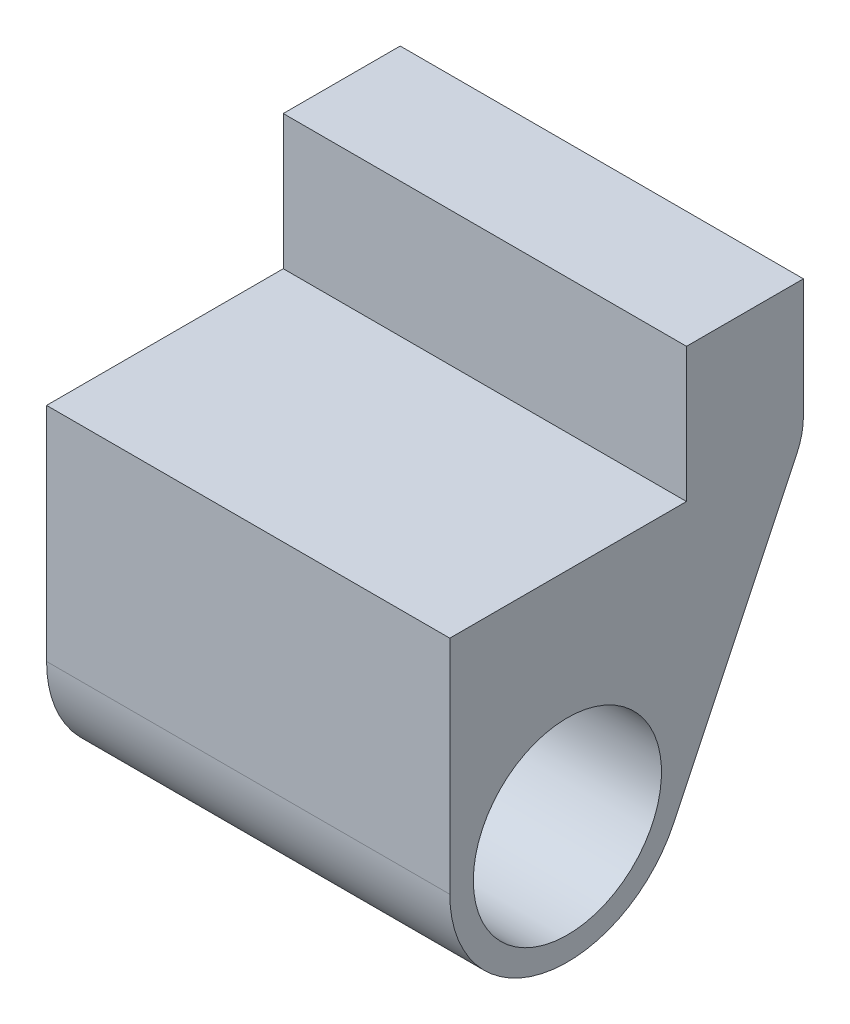
ISO-10303-21;
HEADER;
FILE_DESCRIPTION(('STEP AP214'),'2;1');
FILE_NAME('part.step','',(''),(''),'','','');
FILE_SCHEMA(('AUTOMOTIVE_DESIGN { 1 0 10303 214 1 1 1 1 }'));
ENDSEC;
DATA;
#1=APPLICATION_CONTEXT('core data for automotive mechanical design processes');
#2=APPLICATION_PROTOCOL_DEFINITION('international standard','automotive_design',2000,#1);
#3=PRODUCT_CONTEXT('',#1,'mechanical');
#4=PRODUCT('Part','Part','',(#3));
#5=PRODUCT_RELATED_PRODUCT_CATEGORY('part','',(#4));
#6=PRODUCT_DEFINITION_FORMATION('','',#4);
#7=PRODUCT_DEFINITION_CONTEXT('part definition',#1,'design');
#8=PRODUCT_DEFINITION('design','',#6,#7);
#9=PRODUCT_DEFINITION_SHAPE('','',#8);
#10=(LENGTH_UNIT() NAMED_UNIT(*) SI_UNIT(.MILLI.,.METRE.));
#11=(NAMED_UNIT(*) PLANE_ANGLE_UNIT() SI_UNIT($,.RADIAN.));
#12=(NAMED_UNIT(*) SI_UNIT($,.STERADIAN.) SOLID_ANGLE_UNIT());
#13=UNCERTAINTY_MEASURE_WITH_UNIT(LENGTH_MEASURE(1.E-05),#10,'distance_accuracy_value','');
#14=(GEOMETRIC_REPRESENTATION_CONTEXT(3) GLOBAL_UNCERTAINTY_ASSIGNED_CONTEXT((#13)) GLOBAL_UNIT_ASSIGNED_CONTEXT((#10,
#11,#12)) REPRESENTATION_CONTEXT('',''));
#15=CARTESIAN_POINT('',(0.,0.,0.));
#16=DIRECTION('',(0.,0.,1.));
#17=DIRECTION('',(1.,0.,0.));
#18=AXIS2_PLACEMENT_3D('',#15,#16,#17);
#19=CARTESIAN_POINT('',(0.,0.,0.));
#20=DIRECTION('',(-1.,0.,0.));
#21=DIRECTION('',(0.,0.,1.));
#22=AXIS2_PLACEMENT_3D('',#19,#20,#21);
#23=PLANE('',#22);
#24=CARTESIAN_POINT('',(0.,7.,0.));
#25=DIRECTION('',(-1.,0.,0.));
#26=DIRECTION('',(0.,0.,-1.));
#27=AXIS2_PLACEMENT_3D('',#24,#25,#26);
#28=CIRCLE('',#27,9.525);
#29=CARTESIAN_POINT('',(0.,7.,-9.52499999999997));
#30=VERTEX_POINT('',#29);
#31=EDGE_CURVE('E190',#30,#30,#28,.T.);
#32=ORIENTED_EDGE('',*,*,#31,.F.);
#33=EDGE_LOOP('',(#32));
#34=FACE_BOUND('',#33,.T.);
#35=CARTESIAN_POINT('',(0.,44.7824585817962,-31.9018486983709));
#36=DIRECTION('',(-1.,0.,0.));
#37=DIRECTION('',(0.,-0.22060552327773,-0.975363113460499));
#38=AXIS2_PLACEMENT_3D('',#35,#36,#37);
#39=CIRCLE('',#38,12.7);
#40=CARTESIAN_POINT('',(0.,44.7824585817962,-44.6018486983709));
#41=VERTEX_POINT('',#40);
#42=CARTESIAN_POINT('',(0.,39.3171281350152,-43.3657120570946));
#43=VERTEX_POINT('',#42);
#44=EDGE_CURVE('E212',#41,#43,#39,.T.);
#45=ORIENTED_EDGE('',*,*,#44,.T.);
#46=DIRECTION('',(0.,0.902666406198719,-0.430340980061497));
#47=VECTOR('',#46,1.);
#48=CARTESIAN_POINT('',(0.,41.91,-44.6018486983709));
#49=LINE('',#48,#47);
#50=CARTESIAN_POINT('',(0.,-9.56432828186677,-20.0617608777666));
#51=VERTEX_POINT('',#50);
#52=EDGE_CURVE('E160',#51,#43,#49,.T.);
#53=ORIENTED_EDGE('',*,*,#52,.F.);
#54=CARTESIAN_POINT('',(0.,0.,0.));
#55=DIRECTION('',(-1.,0.,0.));
#56=DIRECTION('',(0.,1.,0.));
#57=AXIS2_PLACEMENT_3D('',#54,#55,#56);
#58=CIRCLE('',#57,22.225);
#59=CARTESIAN_POINT('',(0.,0.,22.225));
#60=VERTEX_POINT('',#59);
#61=EDGE_CURVE('E11',#51,#60,#58,.T.);
#62=ORIENTED_EDGE('',*,*,#61,.T.);
#63=DIRECTION('',(0.,1.,0.));
#64=VECTOR('',#63,1.);
#65=CARTESIAN_POINT('',(0.,0.,22.225));
#66=LINE('',#65,#64);
#67=CARTESIAN_POINT('',(0.,41.91,22.225));
#68=VERTEX_POINT('',#67);
#69=EDGE_CURVE('E46',#60,#68,#66,.T.);
#70=ORIENTED_EDGE('',*,*,#69,.T.);
#71=DIRECTION('',(0.,0.,-1.));
#72=VECTOR('',#71,1.);
#73=CARTESIAN_POINT('',(0.,41.91,22.225));
#74=LINE('',#73,#72);
#75=CARTESIAN_POINT('',(0.,41.91,-22.5038486983708));
#76=VERTEX_POINT('',#75);
#77=EDGE_CURVE('E72',#68,#76,#74,.T.);
#78=ORIENTED_EDGE('',*,*,#77,.T.);
#79=DIRECTION('',(0.,-1.,0.));
#80=VECTOR('',#79,1.);
#81=CARTESIAN_POINT('',(0.,41.91,-22.5038486983708));
#82=LINE('',#81,#80);
#83=CARTESIAN_POINT('',(0.,67.31,-22.5038486983708));
#84=VERTEX_POINT('',#83);
#85=EDGE_CURVE('E163',#84,#76,#82,.T.);
#86=ORIENTED_EDGE('',*,*,#85,.F.);
#87=DIRECTION('',(0.,0.,1.));
#88=VECTOR('',#87,1.);
#89=CARTESIAN_POINT('',(0.,67.31,-22.5038486983708));
#90=LINE('',#89,#88);
#91=CARTESIAN_POINT('',(0.,67.31,-44.6018486983709));
#92=VERTEX_POINT('',#91);
#93=EDGE_CURVE('E64',#92,#84,#90,.T.);
#94=ORIENTED_EDGE('',*,*,#93,.F.);
#95=DIRECTION('',(0.,1.,0.));
#96=VECTOR('',#95,1.);
#97=CARTESIAN_POINT('',(0.,67.31,-44.6018486983709));
#98=LINE('',#97,#96);
#99=EDGE_CURVE('E183',#41,#92,#98,.T.);
#100=ORIENTED_EDGE('',*,*,#99,.F.);
#101=EDGE_LOOP('',(#45,#53,#62,#70,#78,#86,#94,#100));
#102=FACE_BOUND('',#101,.T.);
#103=ADVANCED_FACE('F17',(#34,#102),#23,.T.);
#104=CARTESIAN_POINT('',(0.,0.,0.));
#105=DIRECTION('',(-1.,0.,0.));
#106=DIRECTION('',(0.,-0.9753631134605,0.220605523277729));
#107=AXIS2_PLACEMENT_3D('',#104,#105,#106);
#108=CYLINDRICAL_SURFACE('',#107,22.225);
#109=DIRECTION('',(-1.,0.,0.));
#110=VECTOR('',#109,1.);
#111=CARTESIAN_POINT('',(0.,-9.5643282818668,-20.0617608777665));
#112=LINE('',#111,#110);
#113=CARTESIAN_POINT('',(76.2,-9.56432828186677,-20.0617608777666));
#114=VERTEX_POINT('',#113);
#115=EDGE_CURVE('E124',#114,#51,#112,.T.);
#116=ORIENTED_EDGE('',*,*,#115,.F.);
#117=CARTESIAN_POINT('',(76.2,0.,0.));
#118=DIRECTION('',(-1.,0.,0.));
#119=DIRECTION('',(0.,1.,0.));
#120=AXIS2_PLACEMENT_3D('',#117,#118,#119);
#121=CIRCLE('',#120,22.225);
#122=CARTESIAN_POINT('',(76.2,0.,22.225));
#123=VERTEX_POINT('',#122);
#124=EDGE_CURVE('E122',#114,#123,#121,.T.);
#125=ORIENTED_EDGE('',*,*,#124,.T.);
#126=DIRECTION('',(1.,0.,0.));
#127=VECTOR('',#126,1.);
#128=CARTESIAN_POINT('',(0.,0.,22.225));
#129=LINE('',#128,#127);
#130=EDGE_CURVE('E26',#60,#123,#129,.T.);
#131=ORIENTED_EDGE('',*,*,#130,.F.);
#132=ORIENTED_EDGE('',*,*,#61,.F.);
#133=EDGE_LOOP('',(#116,#125,#131,#132));
#134=FACE_BOUND('',#133,.T.);
#135=ADVANCED_FACE('F19',(#134),#108,.T.);
#136=CARTESIAN_POINT('',(0.,0.,22.225));
#137=DIRECTION('',(0.,0.,-1.));
#138=DIRECTION('',(0.,-1.,0.));
#139=AXIS2_PLACEMENT_3D('',#136,#137,#138);
#140=PLANE('',#139);
#141=ORIENTED_EDGE('',*,*,#69,.F.);
#142=ORIENTED_EDGE('',*,*,#130,.T.);
#143=DIRECTION('',(0.,1.,0.));
#144=VECTOR('',#143,1.);
#145=CARTESIAN_POINT('',(76.2,0.,22.225));
#146=LINE('',#145,#144);
#147=CARTESIAN_POINT('',(76.2,41.91,22.225));
#148=VERTEX_POINT('',#147);
#149=EDGE_CURVE('E116',#123,#148,#146,.T.);
#150=ORIENTED_EDGE('',*,*,#149,.T.);
#151=DIRECTION('',(1.,0.,0.));
#152=VECTOR('',#151,1.);
#153=CARTESIAN_POINT('',(0.,41.91,22.225));
#154=LINE('',#153,#152);
#155=EDGE_CURVE('E108',#68,#148,#154,.T.);
#156=ORIENTED_EDGE('',*,*,#155,.F.);
#157=EDGE_LOOP('',(#141,#142,#150,#156));
#158=FACE_BOUND('',#157,.T.);
#159=ADVANCED_FACE('F114',(#158),#140,.F.);
#160=CARTESIAN_POINT('',(5.08,0.,0.));
#161=DIRECTION('',(-1.,0.,0.));
#162=DIRECTION('',(0.,0.,1.));
#163=AXIS2_PLACEMENT_3D('',#160,#161,#162);
#164=PLANE('',#163);
#165=CARTESIAN_POINT('',(5.08,7.,0.));
#166=DIRECTION('',(1.,0.,0.));
#167=DIRECTION('',(0.,0.,-1.));
#168=AXIS2_PLACEMENT_3D('',#165,#166,#167);
#169=CIRCLE('',#168,9.525);
#170=CARTESIAN_POINT('',(5.08,7.,-9.52499999999997));
#171=VERTEX_POINT('',#170);
#172=EDGE_CURVE('E193',#171,#171,#169,.T.);
#173=ORIENTED_EDGE('',*,*,#172,.F.);
#174=EDGE_LOOP('',(#173));
#175=FACE_BOUND('',#174,.T.);
#176=CARTESIAN_POINT('',(5.08,0.,0.));
#177=DIRECTION('',(1.,0.,0.));
#178=DIRECTION('',(0.,0.,1.));
#179=AXIS2_PLACEMENT_3D('',#176,#177,#178);
#180=CIRCLE('',#179,17.78);
#181=CARTESIAN_POINT('',(5.08,0.,17.78));
#182=VERTEX_POINT('',#181);
#183=EDGE_CURVE('E194',#182,#182,#180,.T.);
#184=ORIENTED_EDGE('',*,*,#183,.T.);
#185=EDGE_LOOP('',(#184));
#186=FACE_BOUND('',#185,.T.);
#187=ADVANCED_FACE('F261',(#175,#186),#164,.F.);
#188=CARTESIAN_POINT('',(76.2,0.,0.));
#189=DIRECTION('',(1.,0.,0.));
#190=DIRECTION('',(0.,0.,1.));
#191=AXIS2_PLACEMENT_3D('',#188,#189,#190);
#192=CYLINDRICAL_SURFACE('',#191,17.78);
#193=ORIENTED_EDGE('',*,*,#183,.F.);
#194=EDGE_LOOP('',(#193));
#195=FACE_BOUND('',#194,.T.);
#196=CARTESIAN_POINT('',(76.2,0.,0.));
#197=DIRECTION('',(1.,0.,0.));
#198=DIRECTION('',(0.,0.,1.));
#199=AXIS2_PLACEMENT_3D('',#196,#197,#198);
#200=CIRCLE('',#199,17.78);
#201=CARTESIAN_POINT('',(76.2,0.,17.78));
#202=VERTEX_POINT('',#201);
#203=EDGE_CURVE('E161',#202,#202,#200,.T.);
#204=ORIENTED_EDGE('',*,*,#203,.T.);
#205=EDGE_LOOP('',(#204));
#206=FACE_BOUND('',#205,.T.);
#207=ADVANCED_FACE('F247',(#195,#206),#192,.F.);
#208=CARTESIAN_POINT('',(0.,7.,0.));
#209=DIRECTION('',(-1.,0.,0.));
#210=DIRECTION('',(0.,0.,-1.));
#211=AXIS2_PLACEMENT_3D('',#208,#209,#210);
#212=CYLINDRICAL_SURFACE('',#211,9.525);
#213=ORIENTED_EDGE('',*,*,#172,.T.);
#214=EDGE_LOOP('',(#213));
#215=FACE_BOUND('',#214,.T.);
#216=ORIENTED_EDGE('',*,*,#31,.T.);
#217=EDGE_LOOP('',(#216));
#218=FACE_BOUND('',#217,.T.);
#219=ADVANCED_FACE('F239',(#215,#218),#212,.F.);
#220=CARTESIAN_POINT('',(0.,41.91,22.225));
#221=DIRECTION('',(0.,-1.,0.));
#222=DIRECTION('',(0.,0.,-1.));
#223=AXIS2_PLACEMENT_3D('',#220,#221,#222);
#224=PLANE('',#223);
#225=DIRECTION('',(1.,0.,0.));
#226=VECTOR('',#225,1.);
#227=CARTESIAN_POINT('',(38.1,41.91,-22.5038486983708));
#228=LINE('',#227,#226);
#229=CARTESIAN_POINT('',(76.2,41.91,-22.5038486983708));
#230=VERTEX_POINT('',#229);
#231=EDGE_CURVE('E166',#76,#230,#228,.T.);
#232=ORIENTED_EDGE('',*,*,#231,.F.);
#233=ORIENTED_EDGE('',*,*,#77,.F.);
#234=ORIENTED_EDGE('',*,*,#155,.T.);
#235=DIRECTION('',(0.,0.,-1.));
#236=VECTOR('',#235,1.);
#237=CARTESIAN_POINT('',(76.2,41.91,22.225));
#238=LINE('',#237,#236);
#239=EDGE_CURVE('E133',#148,#230,#238,.T.);
#240=ORIENTED_EDGE('',*,*,#239,.T.);
#241=EDGE_LOOP('',(#232,#233,#234,#240));
#242=FACE_BOUND('',#241,.T.);
#243=ADVANCED_FACE('F237',(#242),#224,.F.);
#244=CARTESIAN_POINT('',(76.2,41.91,-44.6018486983709));
#245=DIRECTION('',(0.,0.,1.));
#246=DIRECTION('',(0.,-1.,0.));
#247=AXIS2_PLACEMENT_3D('',#244,#245,#246);
#248=PLANE('',#247);
#249=DIRECTION('',(-1.,0.,0.));
#250=VECTOR('',#249,1.);
#251=CARTESIAN_POINT('',(76.2,44.7824585817962,-44.6018486983709));
#252=LINE('',#251,#250);
#253=CARTESIAN_POINT('',(76.2,44.7824585817962,-44.6018486983709));
#254=VERTEX_POINT('',#253);
#255=EDGE_CURVE('E214',#254,#41,#252,.T.);
#256=ORIENTED_EDGE('',*,*,#255,.T.);
#257=ORIENTED_EDGE('',*,*,#99,.T.);
#258=DIRECTION('',(-1.,0.,0.));
#259=VECTOR('',#258,1.);
#260=CARTESIAN_POINT('',(76.2,67.31,-44.6018486983709));
#261=LINE('',#260,#259);
#262=CARTESIAN_POINT('',(76.2,67.31,-44.6018486983709));
#263=VERTEX_POINT('',#262);
#264=EDGE_CURVE('E178',#263,#92,#261,.T.);
#265=ORIENTED_EDGE('',*,*,#264,.F.);
#266=DIRECTION('',(0.,-1.,0.));
#267=VECTOR('',#266,1.);
#268=CARTESIAN_POINT('',(76.2,67.31,-44.6018486983709));
#269=LINE('',#268,#267);
#270=EDGE_CURVE('E149',#263,#254,#269,.T.);
#271=ORIENTED_EDGE('',*,*,#270,.T.);
#272=EDGE_LOOP('',(#256,#257,#265,#271));
#273=FACE_BOUND('',#272,.T.);
#274=ADVANCED_FACE('F232',(#273),#248,.F.);
#275=CARTESIAN_POINT('',(76.2,67.31,-44.6018486983709));
#276=DIRECTION('',(0.,-1.,0.));
#277=DIRECTION('',(-1.,0.,0.));
#278=AXIS2_PLACEMENT_3D('',#275,#276,#277);
#279=PLANE('',#278);
#280=DIRECTION('',(0.,0.,-1.));
#281=VECTOR('',#280,1.);
#282=CARTESIAN_POINT('',(76.2,67.31,-22.5038486983708));
#283=LINE('',#282,#281);
#284=CARTESIAN_POINT('',(76.2,67.31,-22.5038486983708));
#285=VERTEX_POINT('',#284);
#286=EDGE_CURVE('E152',#285,#263,#283,.T.);
#287=ORIENTED_EDGE('',*,*,#286,.T.);
#288=ORIENTED_EDGE('',*,*,#264,.T.);
#289=ORIENTED_EDGE('',*,*,#93,.T.);
#290=DIRECTION('',(-1.,0.,0.));
#291=VECTOR('',#290,1.);
#292=CARTESIAN_POINT('',(76.2,67.31,-22.5038486983708));
#293=LINE('',#292,#291);
#294=EDGE_CURVE('E167',#285,#84,#293,.T.);
#295=ORIENTED_EDGE('',*,*,#294,.F.);
#296=EDGE_LOOP('',(#287,#288,#289,#295));
#297=FACE_BOUND('',#296,.T.);
#298=ADVANCED_FACE('F233',(#297),#279,.F.);
#299=CARTESIAN_POINT('',(76.2,67.31,-22.5038486983708));
#300=DIRECTION('',(0.,0.,-1.));
#301=DIRECTION('',(0.,-1.,0.));
#302=AXIS2_PLACEMENT_3D('',#299,#300,#301);
#303=PLANE('',#302);
#304=DIRECTION('',(0.,1.,0.));
#305=VECTOR('',#304,1.);
#306=CARTESIAN_POINT('',(76.2,41.91,-22.5038486983708));
#307=LINE('',#306,#305);
#308=EDGE_CURVE('E140',#230,#285,#307,.T.);
#309=ORIENTED_EDGE('',*,*,#308,.T.);
#310=ORIENTED_EDGE('',*,*,#294,.T.);
#311=ORIENTED_EDGE('',*,*,#85,.T.);
#312=ORIENTED_EDGE('',*,*,#231,.T.);
#313=EDGE_LOOP('',(#309,#310,#311,#312));
#314=FACE_BOUND('',#313,.T.);
#315=ADVANCED_FACE('F236',(#314),#303,.F.);
#316=CARTESIAN_POINT('',(76.2,-9.56432828186677,-20.0617608777665));
#317=DIRECTION('',(0.,0.430340980061497,0.902666406198719));
#318=DIRECTION('',(1.,0.,0.));
#319=AXIS2_PLACEMENT_3D('',#316,#317,#318);
#320=PLANE('',#319);
#321=DIRECTION('',(1.,0.,0.));
#322=VECTOR('',#321,1.);
#323=CARTESIAN_POINT('',(76.2,39.3171281350152,-43.3657120570946));
#324=LINE('',#323,#322);
#325=CARTESIAN_POINT('',(76.2,39.3171281350152,-43.3657120570946));
#326=VERTEX_POINT('',#325);
#327=EDGE_CURVE('E146',#43,#326,#324,.T.);
#328=ORIENTED_EDGE('',*,*,#327,.T.);
#329=DIRECTION('',(0.,-0.902666406198719,0.430340980061497));
#330=VECTOR('',#329,1.);
#331=CARTESIAN_POINT('',(76.2,41.91,-44.6018486983709));
#332=LINE('',#331,#330);
#333=EDGE_CURVE('E128',#326,#114,#332,.T.);
#334=ORIENTED_EDGE('',*,*,#333,.T.);
#335=ORIENTED_EDGE('',*,*,#115,.T.);
#336=ORIENTED_EDGE('',*,*,#52,.T.);
#337=EDGE_LOOP('',(#328,#334,#335,#336));
#338=FACE_BOUND('',#337,.T.);
#339=ADVANCED_FACE('F273',(#338),#320,.F.);
#340=CARTESIAN_POINT('',(76.2,0.,0.));
#341=DIRECTION('',(-1.,0.,0.));
#342=DIRECTION('',(0.,0.,1.));
#343=AXIS2_PLACEMENT_3D('',#340,#341,#342);
#344=PLANE('',#343);
#345=ORIENTED_EDGE('',*,*,#203,.F.);
#346=EDGE_LOOP('',(#345));
#347=FACE_BOUND('',#346,.T.);
#348=CARTESIAN_POINT('',(76.2,44.7824585817962,-31.9018486983709));
#349=DIRECTION('',(1.,0.,0.));
#350=DIRECTION('',(0.,-0.22060552327773,-0.975363113460499));
#351=AXIS2_PLACEMENT_3D('',#348,#349,#350);
#352=CIRCLE('',#351,12.7);
#353=EDGE_CURVE('E144',#326,#254,#352,.T.);
#354=ORIENTED_EDGE('',*,*,#353,.T.);
#355=ORIENTED_EDGE('',*,*,#270,.F.);
#356=ORIENTED_EDGE('',*,*,#286,.F.);
#357=ORIENTED_EDGE('',*,*,#308,.F.);
#358=ORIENTED_EDGE('',*,*,#239,.F.);
#359=ORIENTED_EDGE('',*,*,#149,.F.);
#360=ORIENTED_EDGE('',*,*,#124,.F.);
#361=ORIENTED_EDGE('',*,*,#333,.F.);
#362=EDGE_LOOP('',(#354,#355,#356,#357,#358,#359,#360,#361));
#363=FACE_BOUND('',#362,.T.);
#364=ADVANCED_FACE('F131',(#347,#363),#344,.F.);
#365=CARTESIAN_POINT('',(76.2,44.7824585817962,-31.9018486983709));
#366=DIRECTION('',(1.,0.,0.));
#367=DIRECTION('',(0.,-0.22060552327773,-0.975363113460499));
#368=AXIS2_PLACEMENT_3D('',#365,#366,#367);
#369=CYLINDRICAL_SURFACE('',#368,12.7);
#370=ORIENTED_EDGE('',*,*,#44,.F.);
#371=ORIENTED_EDGE('',*,*,#255,.F.);
#372=ORIENTED_EDGE('',*,*,#353,.F.);
#373=ORIENTED_EDGE('',*,*,#327,.F.);
#374=EDGE_LOOP('',(#370,#371,#372,#373));
#375=FACE_BOUND('',#374,.T.);
#376=ADVANCED_FACE('F229',(#375),#369,.T.);
#377=CLOSED_SHELL('',(#103,#135,#159,#187,#207,#219,#243,#274,#298,#315,#339,#364,#376));
#378=MANIFOLD_SOLID_BREP('B1',#377);
#379=ADVANCED_BREP_SHAPE_REPRESENTATION('',(#18,#378),#14);
#380=SHAPE_DEFINITION_REPRESENTATION(#9,#379);
ENDSEC;
END-ISO-10303-21;
